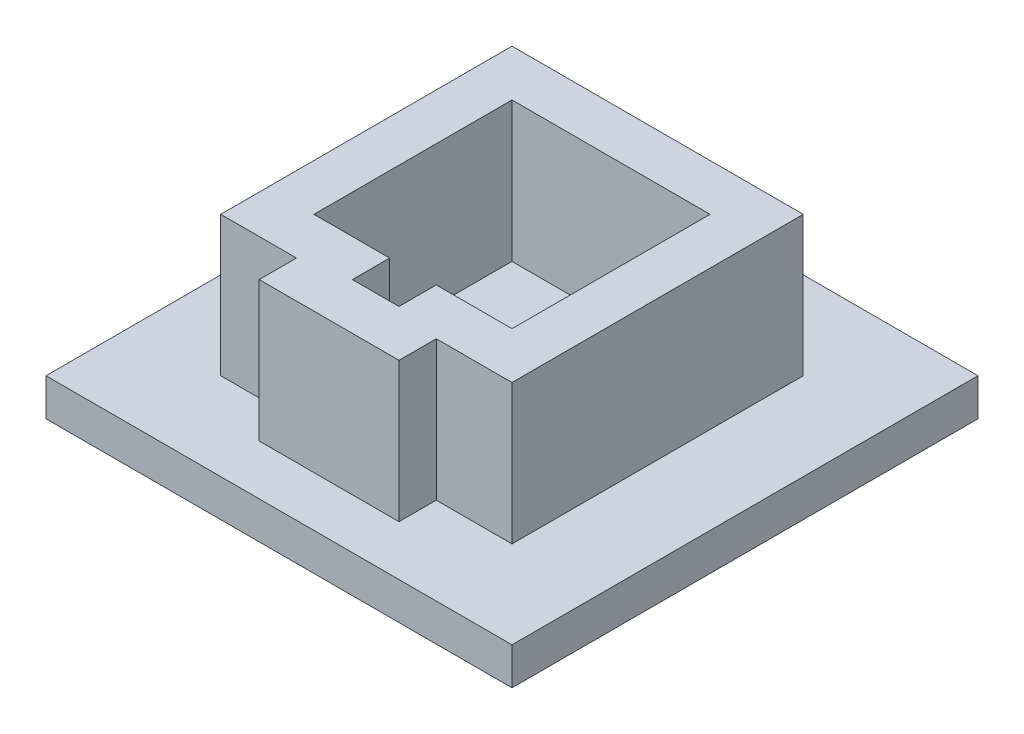
ISO-10303-21;
HEADER;
FILE_DESCRIPTION(('STEP AP214'),'2;1');
FILE_NAME('part.step','',(''),(''),'','','');
FILE_SCHEMA(('AUTOMOTIVE_DESIGN { 1 0 10303 214 1 1 1 1 }'));
ENDSEC;
DATA;
#1=APPLICATION_CONTEXT('core data for automotive mechanical design processes');
#2=APPLICATION_PROTOCOL_DEFINITION('international standard','automotive_design',2000,#1);
#3=PRODUCT_CONTEXT('',#1,'mechanical');
#4=PRODUCT('Part','Part','',(#3));
#5=PRODUCT_RELATED_PRODUCT_CATEGORY('part','',(#4));
#6=PRODUCT_DEFINITION_FORMATION('','',#4);
#7=PRODUCT_DEFINITION_CONTEXT('part definition',#1,'design');
#8=PRODUCT_DEFINITION('design','',#6,#7);
#9=PRODUCT_DEFINITION_SHAPE('','',#8);
#10=(LENGTH_UNIT() NAMED_UNIT(*) SI_UNIT(.MILLI.,.METRE.));
#11=(NAMED_UNIT(*) PLANE_ANGLE_UNIT() SI_UNIT($,.RADIAN.));
#12=(NAMED_UNIT(*) SI_UNIT($,.STERADIAN.) SOLID_ANGLE_UNIT());
#13=UNCERTAINTY_MEASURE_WITH_UNIT(LENGTH_MEASURE(1.E-05),#10,'distance_accuracy_value','');
#14=(GEOMETRIC_REPRESENTATION_CONTEXT(3) GLOBAL_UNCERTAINTY_ASSIGNED_CONTEXT((#13)) GLOBAL_UNIT_ASSIGNED_CONTEXT((#10,
#11,#12)) REPRESENTATION_CONTEXT('',''));
#15=CARTESIAN_POINT('',(0.,0.,0.));
#16=DIRECTION('',(0.,0.,1.));
#17=DIRECTION('',(1.,0.,0.));
#18=AXIS2_PLACEMENT_3D('',#15,#16,#17);
#19=CARTESIAN_POINT('',(0.,38.,0.));
#20=DIRECTION('',(0.,-1.,0.));
#21=DIRECTION('',(0.,0.,-1.));
#22=AXIS2_PLACEMENT_3D('',#19,#20,#21);
#23=PLANE('',#22);
#24=DIRECTION('',(0.,0.,1.));
#25=VECTOR('',#24,1.);
#26=CARTESIAN_POINT('',(28.75,38.,-71.25));
#27=LINE('',#26,#25);
#28=CARTESIAN_POINT('',(28.75,38.,-71.25));
#29=VERTEX_POINT('',#28);
#30=CARTESIAN_POINT('',(28.75,38.,-28.75));
#31=VERTEX_POINT('',#30);
#32=EDGE_CURVE('E249',#29,#31,#27,.T.);
#33=ORIENTED_EDGE('',*,*,#32,.F.);
#34=DIRECTION('',(-1.,0.,0.));
#35=VECTOR('',#34,1.);
#36=CARTESIAN_POINT('',(28.75,38.,-71.25));
#37=LINE('',#36,#35);
#38=CARTESIAN_POINT('',(71.25,38.,-71.25));
#39=VERTEX_POINT('',#38);
#40=EDGE_CURVE('E265',#39,#29,#37,.T.);
#41=ORIENTED_EDGE('',*,*,#40,.F.);
#42=DIRECTION('',(0.,0.,-1.));
#43=VECTOR('',#42,1.);
#44=CARTESIAN_POINT('',(71.25,38.,-71.25));
#45=LINE('',#44,#43);
#46=CARTESIAN_POINT('',(71.25,38.,-28.75));
#47=VERTEX_POINT('',#46);
#48=EDGE_CURVE('E262',#47,#39,#45,.T.);
#49=ORIENTED_EDGE('',*,*,#48,.F.);
#50=DIRECTION('',(1.,0.,0.));
#51=VECTOR('',#50,1.);
#52=CARTESIAN_POINT('',(55.,38.,-28.75));
#53=LINE('',#52,#51);
#54=CARTESIAN_POINT('',(55.,38.,-28.75));
#55=VERTEX_POINT('',#54);
#56=EDGE_CURVE('E260',#55,#47,#53,.T.);
#57=ORIENTED_EDGE('',*,*,#56,.F.);
#58=DIRECTION('',(0.,0.,-1.));
#59=VECTOR('',#58,1.);
#60=CARTESIAN_POINT('',(55.,38.,-28.75));
#61=LINE('',#60,#59);
#62=CARTESIAN_POINT('',(55.,38.,-20.75));
#63=VERTEX_POINT('',#62);
#64=EDGE_CURVE('E258',#63,#55,#61,.T.);
#65=ORIENTED_EDGE('',*,*,#64,.F.);
#66=DIRECTION('',(1.,0.,0.));
#67=VECTOR('',#66,1.);
#68=CARTESIAN_POINT('',(45.,38.,-20.75));
#69=LINE('',#68,#67);
#70=CARTESIAN_POINT('',(45.,38.,-20.75));
#71=VERTEX_POINT('',#70);
#72=EDGE_CURVE('E256',#71,#63,#69,.T.);
#73=ORIENTED_EDGE('',*,*,#72,.F.);
#74=DIRECTION('',(0.,0.,1.));
#75=VECTOR('',#74,1.);
#76=CARTESIAN_POINT('',(45.,38.,-28.75));
#77=LINE('',#76,#75);
#78=CARTESIAN_POINT('',(45.,38.,-28.75));
#79=VERTEX_POINT('',#78);
#80=EDGE_CURVE('E254',#79,#71,#77,.T.);
#81=ORIENTED_EDGE('',*,*,#80,.F.);
#82=DIRECTION('',(1.,0.,0.));
#83=VECTOR('',#82,1.);
#84=CARTESIAN_POINT('',(28.75,38.,-28.75));
#85=LINE('',#84,#83);
#86=EDGE_CURVE('E251',#31,#79,#85,.T.);
#87=ORIENTED_EDGE('',*,*,#86,.F.);
#88=EDGE_LOOP('',(#33,#41,#49,#57,#65,#73,#81,#87));
#89=FACE_BOUND('',#88,.T.);
#90=DIRECTION('',(0.,0.,1.));
#91=VECTOR('',#90,1.);
#92=CARTESIAN_POINT('',(18.75,38.,-81.25));
#93=LINE('',#92,#91);
#94=CARTESIAN_POINT('',(18.75,38.,-81.25));
#95=VERTEX_POINT('',#94);
#96=CARTESIAN_POINT('',(18.75,38.,-18.75));
#97=VERTEX_POINT('',#96);
#98=EDGE_CURVE('E214',#95,#97,#93,.T.);
#99=ORIENTED_EDGE('',*,*,#98,.T.);
#100=DIRECTION('',(1.,0.,0.));
#101=VECTOR('',#100,1.);
#102=CARTESIAN_POINT('',(18.75,38.,-18.75));
#103=LINE('',#102,#101);
#104=CARTESIAN_POINT('',(35.,38.,-18.75));
#105=VERTEX_POINT('',#104);
#106=EDGE_CURVE('E174',#97,#105,#103,.T.);
#107=ORIENTED_EDGE('',*,*,#106,.T.);
#108=DIRECTION('',(0.,0.,1.));
#109=VECTOR('',#108,1.);
#110=CARTESIAN_POINT('',(35.,38.,-18.75));
#111=LINE('',#110,#109);
#112=CARTESIAN_POINT('',(35.,38.,-10.75));
#113=VERTEX_POINT('',#112);
#114=EDGE_CURVE('E55',#105,#113,#111,.T.);
#115=ORIENTED_EDGE('',*,*,#114,.T.);
#116=DIRECTION('',(1.,0.,0.));
#117=VECTOR('',#116,1.);
#118=CARTESIAN_POINT('',(35.,38.,-10.75));
#119=LINE('',#118,#117);
#120=CARTESIAN_POINT('',(65.,38.,-10.75));
#121=VERTEX_POINT('',#120);
#122=EDGE_CURVE('E218',#113,#121,#119,.T.);
#123=ORIENTED_EDGE('',*,*,#122,.T.);
#124=DIRECTION('',(0.,0.,-1.));
#125=VECTOR('',#124,1.);
#126=CARTESIAN_POINT('',(65.,38.,-10.75));
#127=LINE('',#126,#125);
#128=CARTESIAN_POINT('',(65.,38.,-18.75));
#129=VERTEX_POINT('',#128);
#130=EDGE_CURVE('E221',#121,#129,#127,.T.);
#131=ORIENTED_EDGE('',*,*,#130,.T.);
#132=DIRECTION('',(1.,0.,0.));
#133=VECTOR('',#132,1.);
#134=CARTESIAN_POINT('',(65.,38.,-18.75));
#135=LINE('',#134,#133);
#136=CARTESIAN_POINT('',(81.25,38.,-18.75));
#137=VERTEX_POINT('',#136);
#138=EDGE_CURVE('E224',#129,#137,#135,.T.);
#139=ORIENTED_EDGE('',*,*,#138,.T.);
#140=DIRECTION('',(0.,0.,-1.));
#141=VECTOR('',#140,1.);
#142=CARTESIAN_POINT('',(81.25,38.,-81.25));
#143=LINE('',#142,#141);
#144=CARTESIAN_POINT('',(81.25,38.,-81.25));
#145=VERTEX_POINT('',#144);
#146=EDGE_CURVE('E197',#137,#145,#143,.T.);
#147=ORIENTED_EDGE('',*,*,#146,.T.);
#148=DIRECTION('',(-1.,0.,0.));
#149=VECTOR('',#148,1.);
#150=CARTESIAN_POINT('',(18.75,38.,-81.25));
#151=LINE('',#150,#149);
#152=EDGE_CURVE('E194',#145,#95,#151,.T.);
#153=ORIENTED_EDGE('',*,*,#152,.T.);
#154=EDGE_LOOP('',(#99,#107,#115,#123,#131,#139,#147,#153));
#155=FACE_BOUND('',#154,.T.);
#156=ADVANCED_FACE('F32',(#89,#155),#23,.F.);
#157=CARTESIAN_POINT('',(28.75,38.,-71.25));
#158=DIRECTION('',(1.,0.,0.));
#159=DIRECTION('',(0.,0.,-1.));
#160=AXIS2_PLACEMENT_3D('',#157,#158,#159);
#161=PLANE('',#160);
#162=DIRECTION('',(0.,0.,1.));
#163=VECTOR('',#162,1.);
#164=CARTESIAN_POINT('',(28.75,8.,-71.25));
#165=LINE('',#164,#163);
#166=CARTESIAN_POINT('',(28.75,8.,-71.25));
#167=VERTEX_POINT('',#166);
#168=CARTESIAN_POINT('',(28.75,8.,-28.75));
#169=VERTEX_POINT('',#168);
#170=EDGE_CURVE('E248',#167,#169,#165,.T.);
#171=ORIENTED_EDGE('',*,*,#170,.F.);
#172=DIRECTION('',(0.,-1.,0.));
#173=VECTOR('',#172,1.);
#174=CARTESIAN_POINT('',(28.75,38.,-71.25));
#175=LINE('',#174,#173);
#176=EDGE_CURVE('E267',#29,#167,#175,.T.);
#177=ORIENTED_EDGE('',*,*,#176,.F.);
#178=ORIENTED_EDGE('',*,*,#32,.T.);
#179=DIRECTION('',(0.,-1.,0.));
#180=VECTOR('',#179,1.);
#181=CARTESIAN_POINT('',(28.75,38.,-28.75));
#182=LINE('',#181,#180);
#183=EDGE_CURVE('E303',#31,#169,#182,.T.);
#184=ORIENTED_EDGE('',*,*,#183,.T.);
#185=EDGE_LOOP('',(#171,#177,#178,#184));
#186=FACE_BOUND('',#185,.T.);
#187=ADVANCED_FACE('F345',(#186),#161,.T.);
#188=CARTESIAN_POINT('',(28.75,38.,-28.75));
#189=DIRECTION('',(0.,0.,-1.));
#190=DIRECTION('',(-1.,0.,0.));
#191=AXIS2_PLACEMENT_3D('',#188,#189,#190);
#192=PLANE('',#191);
#193=DIRECTION('',(1.,0.,0.));
#194=VECTOR('',#193,1.);
#195=CARTESIAN_POINT('',(28.75,8.,-28.75));
#196=LINE('',#195,#194);
#197=CARTESIAN_POINT('',(45.,8.,-28.75));
#198=VERTEX_POINT('',#197);
#199=EDGE_CURVE('E270',#169,#198,#196,.T.);
#200=ORIENTED_EDGE('',*,*,#199,.F.);
#201=ORIENTED_EDGE('',*,*,#183,.F.);
#202=ORIENTED_EDGE('',*,*,#86,.T.);
#203=DIRECTION('',(0.,-1.,0.));
#204=VECTOR('',#203,1.);
#205=CARTESIAN_POINT('',(45.,38.,-28.75));
#206=LINE('',#205,#204);
#207=EDGE_CURVE('E301',#79,#198,#206,.T.);
#208=ORIENTED_EDGE('',*,*,#207,.T.);
#209=EDGE_LOOP('',(#200,#201,#202,#208));
#210=FACE_BOUND('',#209,.T.);
#211=ADVANCED_FACE('F353',(#210),#192,.T.);
#212=CARTESIAN_POINT('',(45.,38.,-28.75));
#213=DIRECTION('',(1.,0.,0.));
#214=DIRECTION('',(0.,0.,-1.));
#215=AXIS2_PLACEMENT_3D('',#212,#213,#214);
#216=PLANE('',#215);
#217=DIRECTION('',(0.,0.,1.));
#218=VECTOR('',#217,1.);
#219=CARTESIAN_POINT('',(45.,8.,-28.75));
#220=LINE('',#219,#218);
#221=CARTESIAN_POINT('',(45.,8.,-20.75));
#222=VERTEX_POINT('',#221);
#223=EDGE_CURVE('E273',#198,#222,#220,.T.);
#224=ORIENTED_EDGE('',*,*,#223,.F.);
#225=ORIENTED_EDGE('',*,*,#207,.F.);
#226=ORIENTED_EDGE('',*,*,#80,.T.);
#227=DIRECTION('',(0.,-1.,0.));
#228=VECTOR('',#227,1.);
#229=CARTESIAN_POINT('',(45.,38.,-20.75));
#230=LINE('',#229,#228);
#231=EDGE_CURVE('E299',#71,#222,#230,.T.);
#232=ORIENTED_EDGE('',*,*,#231,.T.);
#233=EDGE_LOOP('',(#224,#225,#226,#232));
#234=FACE_BOUND('',#233,.T.);
#235=ADVANCED_FACE('F426',(#234),#216,.T.);
#236=CARTESIAN_POINT('',(45.,38.,-20.75));
#237=DIRECTION('',(0.,0.,-1.));
#238=DIRECTION('',(-1.,0.,0.));
#239=AXIS2_PLACEMENT_3D('',#236,#237,#238);
#240=PLANE('',#239);
#241=DIRECTION('',(1.,0.,0.));
#242=VECTOR('',#241,1.);
#243=CARTESIAN_POINT('',(45.,8.,-20.75));
#244=LINE('',#243,#242);
#245=CARTESIAN_POINT('',(55.,8.,-20.75));
#246=VERTEX_POINT('',#245);
#247=EDGE_CURVE('E276',#222,#246,#244,.T.);
#248=ORIENTED_EDGE('',*,*,#247,.F.);
#249=ORIENTED_EDGE('',*,*,#231,.F.);
#250=ORIENTED_EDGE('',*,*,#72,.T.);
#251=DIRECTION('',(0.,-1.,0.));
#252=VECTOR('',#251,1.);
#253=CARTESIAN_POINT('',(55.,38.,-20.75));
#254=LINE('',#253,#252);
#255=EDGE_CURVE('E297',#63,#246,#254,.T.);
#256=ORIENTED_EDGE('',*,*,#255,.T.);
#257=EDGE_LOOP('',(#248,#249,#250,#256));
#258=FACE_BOUND('',#257,.T.);
#259=ADVANCED_FACE('F434',(#258),#240,.T.);
#260=CARTESIAN_POINT('',(55.,38.,-28.75));
#261=DIRECTION('',(-1.,0.,0.));
#262=DIRECTION('',(0.,0.,1.));
#263=AXIS2_PLACEMENT_3D('',#260,#261,#262);
#264=PLANE('',#263);
#265=DIRECTION('',(0.,0.,-1.));
#266=VECTOR('',#265,1.);
#267=CARTESIAN_POINT('',(55.,8.,-28.75));
#268=LINE('',#267,#266);
#269=CARTESIAN_POINT('',(55.,8.,-28.75));
#270=VERTEX_POINT('',#269);
#271=EDGE_CURVE('E279',#246,#270,#268,.T.);
#272=ORIENTED_EDGE('',*,*,#271,.F.);
#273=ORIENTED_EDGE('',*,*,#255,.F.);
#274=ORIENTED_EDGE('',*,*,#64,.T.);
#275=DIRECTION('',(0.,-1.,0.));
#276=VECTOR('',#275,1.);
#277=CARTESIAN_POINT('',(55.,38.,-28.75));
#278=LINE('',#277,#276);
#279=EDGE_CURVE('E295',#55,#270,#278,.T.);
#280=ORIENTED_EDGE('',*,*,#279,.T.);
#281=EDGE_LOOP('',(#272,#273,#274,#280));
#282=FACE_BOUND('',#281,.T.);
#283=ADVANCED_FACE('F443',(#282),#264,.T.);
#284=CARTESIAN_POINT('',(55.,38.,-28.75));
#285=DIRECTION('',(0.,0.,-1.));
#286=DIRECTION('',(-1.,0.,0.));
#287=AXIS2_PLACEMENT_3D('',#284,#285,#286);
#288=PLANE('',#287);
#289=DIRECTION('',(1.,0.,0.));
#290=VECTOR('',#289,1.);
#291=CARTESIAN_POINT('',(55.,8.,-28.75));
#292=LINE('',#291,#290);
#293=CARTESIAN_POINT('',(71.25,8.,-28.75));
#294=VERTEX_POINT('',#293);
#295=EDGE_CURVE('E282',#270,#294,#292,.T.);
#296=ORIENTED_EDGE('',*,*,#295,.F.);
#297=ORIENTED_EDGE('',*,*,#279,.F.);
#298=ORIENTED_EDGE('',*,*,#56,.T.);
#299=DIRECTION('',(0.,-1.,0.));
#300=VECTOR('',#299,1.);
#301=CARTESIAN_POINT('',(71.25,38.,-28.75));
#302=LINE('',#301,#300);
#303=EDGE_CURVE('E293',#47,#294,#302,.T.);
#304=ORIENTED_EDGE('',*,*,#303,.T.);
#305=EDGE_LOOP('',(#296,#297,#298,#304));
#306=FACE_BOUND('',#305,.T.);
#307=ADVANCED_FACE('F452',(#306),#288,.T.);
#308=CARTESIAN_POINT('',(71.25,38.,-71.25));
#309=DIRECTION('',(-1.,0.,0.));
#310=DIRECTION('',(0.,0.,1.));
#311=AXIS2_PLACEMENT_3D('',#308,#309,#310);
#312=PLANE('',#311);
#313=DIRECTION('',(0.,0.,-1.));
#314=VECTOR('',#313,1.);
#315=CARTESIAN_POINT('',(71.25,8.,-71.25));
#316=LINE('',#315,#314);
#317=CARTESIAN_POINT('',(71.25,8.,-71.25));
#318=VERTEX_POINT('',#317);
#319=EDGE_CURVE('E285',#294,#318,#316,.T.);
#320=ORIENTED_EDGE('',*,*,#319,.F.);
#321=ORIENTED_EDGE('',*,*,#303,.F.);
#322=ORIENTED_EDGE('',*,*,#48,.T.);
#323=DIRECTION('',(0.,-1.,0.));
#324=VECTOR('',#323,1.);
#325=CARTESIAN_POINT('',(71.25,38.,-71.25));
#326=LINE('',#325,#324);
#327=EDGE_CURVE('E291',#39,#318,#326,.T.);
#328=ORIENTED_EDGE('',*,*,#327,.T.);
#329=EDGE_LOOP('',(#320,#321,#322,#328));
#330=FACE_BOUND('',#329,.T.);
#331=ADVANCED_FACE('F461',(#330),#312,.T.);
#332=CARTESIAN_POINT('',(28.75,38.,-71.25));
#333=DIRECTION('',(0.,0.,1.));
#334=DIRECTION('',(1.,0.,0.));
#335=AXIS2_PLACEMENT_3D('',#332,#333,#334);
#336=PLANE('',#335);
#337=DIRECTION('',(-1.,0.,0.));
#338=VECTOR('',#337,1.);
#339=CARTESIAN_POINT('',(28.75,8.,-71.25));
#340=LINE('',#339,#338);
#341=EDGE_CURVE('E252',#318,#167,#340,.T.);
#342=ORIENTED_EDGE('',*,*,#341,.F.);
#343=ORIENTED_EDGE('',*,*,#327,.F.);
#344=ORIENTED_EDGE('',*,*,#40,.T.);
#345=ORIENTED_EDGE('',*,*,#176,.T.);
#346=EDGE_LOOP('',(#342,#343,#344,#345));
#347=FACE_BOUND('',#346,.T.);
#348=ADVANCED_FACE('F363',(#347),#336,.T.);
#349=CARTESIAN_POINT('',(0.,8.,0.));
#350=DIRECTION('',(0.,-1.,0.));
#351=DIRECTION('',(0.,0.,-1.));
#352=AXIS2_PLACEMENT_3D('',#349,#350,#351);
#353=PLANE('',#352);
#354=ORIENTED_EDGE('',*,*,#341,.T.);
#355=ORIENTED_EDGE('',*,*,#170,.T.);
#356=ORIENTED_EDGE('',*,*,#199,.T.);
#357=ORIENTED_EDGE('',*,*,#223,.T.);
#358=ORIENTED_EDGE('',*,*,#247,.T.);
#359=ORIENTED_EDGE('',*,*,#271,.T.);
#360=ORIENTED_EDGE('',*,*,#295,.T.);
#361=ORIENTED_EDGE('',*,*,#319,.T.);
#362=EDGE_LOOP('',(#354,#355,#356,#357,#358,#359,#360,#361));
#363=FACE_BOUND('',#362,.T.);
#364=ADVANCED_FACE('F360',(#363),#353,.F.);
#365=CARTESIAN_POINT('',(0.,8.,0.));
#366=DIRECTION('',(0.,-1.,0.));
#367=DIRECTION('',(0.,0.,-1.));
#368=AXIS2_PLACEMENT_3D('',#365,#366,#367);
#369=PLANE('',#368);
#370=DIRECTION('',(0.,0.,1.));
#371=VECTOR('',#370,1.);
#372=CARTESIAN_POINT('',(18.75,8.,-81.25));
#373=LINE('',#372,#371);
#374=CARTESIAN_POINT('',(18.75,8.,-81.25));
#375=VERTEX_POINT('',#374);
#376=CARTESIAN_POINT('',(18.75,8.,-18.75));
#377=VERTEX_POINT('',#376);
#378=EDGE_CURVE('E186',#375,#377,#373,.T.);
#379=ORIENTED_EDGE('',*,*,#378,.F.);
#380=DIRECTION('',(-1.,0.,0.));
#381=VECTOR('',#380,1.);
#382=CARTESIAN_POINT('',(18.75,8.,-81.25));
#383=LINE('',#382,#381);
#384=CARTESIAN_POINT('',(81.25,8.,-81.25));
#385=VERTEX_POINT('',#384);
#386=EDGE_CURVE('E180',#385,#375,#383,.T.);
#387=ORIENTED_EDGE('',*,*,#386,.F.);
#388=DIRECTION('',(0.,0.,-1.));
#389=VECTOR('',#388,1.);
#390=CARTESIAN_POINT('',(81.25,8.,-81.25));
#391=LINE('',#390,#389);
#392=CARTESIAN_POINT('',(81.25,8.,-18.75));
#393=VERTEX_POINT('',#392);
#394=EDGE_CURVE('E210',#393,#385,#391,.T.);
#395=ORIENTED_EDGE('',*,*,#394,.F.);
#396=DIRECTION('',(1.,0.,0.));
#397=VECTOR('',#396,1.);
#398=CARTESIAN_POINT('',(65.,8.,-18.75));
#399=LINE('',#398,#397);
#400=CARTESIAN_POINT('',(65.,8.,-18.75));
#401=VERTEX_POINT('',#400);
#402=EDGE_CURVE('E207',#401,#393,#399,.T.);
#403=ORIENTED_EDGE('',*,*,#402,.F.);
#404=DIRECTION('',(0.,0.,-1.));
#405=VECTOR('',#404,1.);
#406=CARTESIAN_POINT('',(65.,8.,-10.75));
#407=LINE('',#406,#405);
#408=CARTESIAN_POINT('',(65.,8.,-10.75));
#409=VERTEX_POINT('',#408);
#410=EDGE_CURVE('E204',#409,#401,#407,.T.);
#411=ORIENTED_EDGE('',*,*,#410,.F.);
#412=DIRECTION('',(1.,0.,0.));
#413=VECTOR('',#412,1.);
#414=CARTESIAN_POINT('',(35.,8.,-10.75));
#415=LINE('',#414,#413);
#416=CARTESIAN_POINT('',(35.,8.,-10.75));
#417=VERTEX_POINT('',#416);
#418=EDGE_CURVE('E201',#417,#409,#415,.T.);
#419=ORIENTED_EDGE('',*,*,#418,.F.);
#420=DIRECTION('',(0.,0.,1.));
#421=VECTOR('',#420,1.);
#422=CARTESIAN_POINT('',(35.,8.,-18.75));
#423=LINE('',#422,#421);
#424=CARTESIAN_POINT('',(35.,8.,-18.75));
#425=VERTEX_POINT('',#424);
#426=EDGE_CURVE('E190',#425,#417,#423,.T.);
#427=ORIENTED_EDGE('',*,*,#426,.F.);
#428=DIRECTION('',(1.,0.,0.));
#429=VECTOR('',#428,1.);
#430=CARTESIAN_POINT('',(18.75,8.,-18.75));
#431=LINE('',#430,#429);
#432=EDGE_CURVE('E172',#377,#425,#431,.T.);
#433=ORIENTED_EDGE('',*,*,#432,.F.);
#434=EDGE_LOOP('',(#379,#387,#395,#403,#411,#419,#427,#433));
#435=FACE_BOUND('',#434,.T.);
#436=DIRECTION('',(0.,0.,1.));
#437=VECTOR('',#436,1.);
#438=CARTESIAN_POINT('',(0.,8.,0.));
#439=LINE('',#438,#437);
#440=CARTESIAN_POINT('',(0.,8.,-100.));
#441=VERTEX_POINT('',#440);
#442=CARTESIAN_POINT('',(0.,8.,0.));
#443=VERTEX_POINT('',#442);
#444=EDGE_CURVE('E230',#441,#443,#439,.T.);
#445=ORIENTED_EDGE('',*,*,#444,.T.);
#446=DIRECTION('',(1.,0.,0.));
#447=VECTOR('',#446,1.);
#448=CARTESIAN_POINT('',(0.,8.,0.));
#449=LINE('',#448,#447);
#450=CARTESIAN_POINT('',(100.,8.,0.));
#451=VERTEX_POINT('',#450);
#452=EDGE_CURVE('E243',#443,#451,#449,.T.);
#453=ORIENTED_EDGE('',*,*,#452,.T.);
#454=DIRECTION('',(0.,0.,-1.));
#455=VECTOR('',#454,1.);
#456=CARTESIAN_POINT('',(100.,8.,0.));
#457=LINE('',#456,#455);
#458=CARTESIAN_POINT('',(100.,8.,-100.));
#459=VERTEX_POINT('',#458);
#460=EDGE_CURVE('E47',#451,#459,#457,.T.);
#461=ORIENTED_EDGE('',*,*,#460,.T.);
#462=DIRECTION('',(-1.,0.,0.));
#463=VECTOR('',#462,1.);
#464=CARTESIAN_POINT('',(0.,8.,-100.));
#465=LINE('',#464,#463);
#466=EDGE_CURVE('E246',#459,#441,#465,.T.);
#467=ORIENTED_EDGE('',*,*,#466,.T.);
#468=EDGE_LOOP('',(#445,#453,#461,#467));
#469=FACE_BOUND('',#468,.T.);
#470=ADVANCED_FACE('F184',(#435,#469),#369,.F.);
#471=CARTESIAN_POINT('',(18.75,8.,-81.25));
#472=DIRECTION('',(-1.,0.,0.));
#473=DIRECTION('',(0.,0.,1.));
#474=AXIS2_PLACEMENT_3D('',#471,#472,#473);
#475=PLANE('',#474);
#476=ORIENTED_EDGE('',*,*,#98,.F.);
#477=DIRECTION('',(0.,1.,0.));
#478=VECTOR('',#477,1.);
#479=CARTESIAN_POINT('',(18.75,8.,-81.25));
#480=LINE('',#479,#478);
#481=EDGE_CURVE('E193',#375,#95,#480,.T.);
#482=ORIENTED_EDGE('',*,*,#481,.F.);
#483=ORIENTED_EDGE('',*,*,#378,.T.);
#484=DIRECTION('',(0.,1.,0.));
#485=VECTOR('',#484,1.);
#486=CARTESIAN_POINT('',(18.75,8.,-18.75));
#487=LINE('',#486,#485);
#488=EDGE_CURVE('E169',#377,#97,#487,.T.);
#489=ORIENTED_EDGE('',*,*,#488,.T.);
#490=EDGE_LOOP('',(#476,#482,#483,#489));
#491=FACE_BOUND('',#490,.T.);
#492=ADVANCED_FACE('F192',(#491),#475,.T.);
#493=CARTESIAN_POINT('',(18.75,8.,-81.25));
#494=DIRECTION('',(0.,0.,-1.));
#495=DIRECTION('',(-1.,0.,0.));
#496=AXIS2_PLACEMENT_3D('',#493,#494,#495);
#497=PLANE('',#496);
#498=ORIENTED_EDGE('',*,*,#152,.F.);
#499=DIRECTION('',(0.,1.,0.));
#500=VECTOR('',#499,1.);
#501=CARTESIAN_POINT('',(81.25,8.,-81.25));
#502=LINE('',#501,#500);
#503=EDGE_CURVE('E231',#385,#145,#502,.T.);
#504=ORIENTED_EDGE('',*,*,#503,.F.);
#505=ORIENTED_EDGE('',*,*,#386,.T.);
#506=ORIENTED_EDGE('',*,*,#481,.T.);
#507=EDGE_LOOP('',(#498,#504,#505,#506));
#508=FACE_BOUND('',#507,.T.);
#509=ADVANCED_FACE('F495',(#508),#497,.T.);
#510=CARTESIAN_POINT('',(81.25,8.,-81.25));
#511=DIRECTION('',(1.,0.,0.));
#512=DIRECTION('',(0.,0.,-1.));
#513=AXIS2_PLACEMENT_3D('',#510,#511,#512);
#514=PLANE('',#513);
#515=ORIENTED_EDGE('',*,*,#146,.F.);
#516=DIRECTION('',(0.,1.,0.));
#517=VECTOR('',#516,1.);
#518=CARTESIAN_POINT('',(81.25,8.,-18.75));
#519=LINE('',#518,#517);
#520=EDGE_CURVE('E233',#393,#137,#519,.T.);
#521=ORIENTED_EDGE('',*,*,#520,.F.);
#522=ORIENTED_EDGE('',*,*,#394,.T.);
#523=ORIENTED_EDGE('',*,*,#503,.T.);
#524=EDGE_LOOP('',(#515,#521,#522,#523));
#525=FACE_BOUND('',#524,.T.);
#526=ADVANCED_FACE('F503',(#525),#514,.T.);
#527=CARTESIAN_POINT('',(65.,8.,-18.75));
#528=DIRECTION('',(0.,0.,1.));
#529=DIRECTION('',(1.,0.,0.));
#530=AXIS2_PLACEMENT_3D('',#527,#528,#529);
#531=PLANE('',#530);
#532=ORIENTED_EDGE('',*,*,#138,.F.);
#533=DIRECTION('',(0.,1.,0.));
#534=VECTOR('',#533,1.);
#535=CARTESIAN_POINT('',(65.,8.,-18.75));
#536=LINE('',#535,#534);
#537=EDGE_CURVE('E235',#401,#129,#536,.T.);
#538=ORIENTED_EDGE('',*,*,#537,.F.);
#539=ORIENTED_EDGE('',*,*,#402,.T.);
#540=ORIENTED_EDGE('',*,*,#520,.T.);
#541=EDGE_LOOP('',(#532,#538,#539,#540));
#542=FACE_BOUND('',#541,.T.);
#543=ADVANCED_FACE('F512',(#542),#531,.T.);
#544=CARTESIAN_POINT('',(65.,8.,-10.75));
#545=DIRECTION('',(1.,0.,0.));
#546=DIRECTION('',(0.,0.,-1.));
#547=AXIS2_PLACEMENT_3D('',#544,#545,#546);
#548=PLANE('',#547);
#549=ORIENTED_EDGE('',*,*,#130,.F.);
#550=DIRECTION('',(0.,1.,0.));
#551=VECTOR('',#550,1.);
#552=CARTESIAN_POINT('',(65.,8.,-10.75));
#553=LINE('',#552,#551);
#554=EDGE_CURVE('E237',#409,#121,#553,.T.);
#555=ORIENTED_EDGE('',*,*,#554,.F.);
#556=ORIENTED_EDGE('',*,*,#410,.T.);
#557=ORIENTED_EDGE('',*,*,#537,.T.);
#558=EDGE_LOOP('',(#549,#555,#556,#557));
#559=FACE_BOUND('',#558,.T.);
#560=ADVANCED_FACE('F521',(#559),#548,.T.);
#561=CARTESIAN_POINT('',(35.,8.,-10.75));
#562=DIRECTION('',(0.,0.,1.));
#563=DIRECTION('',(1.,0.,0.));
#564=AXIS2_PLACEMENT_3D('',#561,#562,#563);
#565=PLANE('',#564);
#566=ORIENTED_EDGE('',*,*,#122,.F.);
#567=DIRECTION('',(0.,1.,0.));
#568=VECTOR('',#567,1.);
#569=CARTESIAN_POINT('',(35.,8.,-10.75));
#570=LINE('',#569,#568);
#571=EDGE_CURVE('E239',#417,#113,#570,.T.);
#572=ORIENTED_EDGE('',*,*,#571,.F.);
#573=ORIENTED_EDGE('',*,*,#418,.T.);
#574=ORIENTED_EDGE('',*,*,#554,.T.);
#575=EDGE_LOOP('',(#566,#572,#573,#574));
#576=FACE_BOUND('',#575,.T.);
#577=ADVANCED_FACE('F530',(#576),#565,.T.);
#578=CARTESIAN_POINT('',(35.,8.,-18.75));
#579=DIRECTION('',(-1.,0.,0.));
#580=DIRECTION('',(0.,0.,1.));
#581=AXIS2_PLACEMENT_3D('',#578,#579,#580);
#582=PLANE('',#581);
#583=ORIENTED_EDGE('',*,*,#114,.F.);
#584=DIRECTION('',(0.,1.,0.));
#585=VECTOR('',#584,1.);
#586=CARTESIAN_POINT('',(35.,8.,-18.75));
#587=LINE('',#586,#585);
#588=EDGE_CURVE('E179',#425,#105,#587,.T.);
#589=ORIENTED_EDGE('',*,*,#588,.F.);
#590=ORIENTED_EDGE('',*,*,#426,.T.);
#591=ORIENTED_EDGE('',*,*,#571,.T.);
#592=EDGE_LOOP('',(#583,#589,#590,#591));
#593=FACE_BOUND('',#592,.T.);
#594=ADVANCED_FACE('F539',(#593),#582,.T.);
#595=CARTESIAN_POINT('',(18.75,8.,-18.75));
#596=DIRECTION('',(0.,0.,1.));
#597=DIRECTION('',(1.,0.,0.));
#598=AXIS2_PLACEMENT_3D('',#595,#596,#597);
#599=PLANE('',#598);
#600=ORIENTED_EDGE('',*,*,#106,.F.);
#601=ORIENTED_EDGE('',*,*,#488,.F.);
#602=ORIENTED_EDGE('',*,*,#432,.T.);
#603=ORIENTED_EDGE('',*,*,#588,.T.);
#604=EDGE_LOOP('',(#600,#601,#602,#603));
#605=FACE_BOUND('',#604,.T.);
#606=ADVANCED_FACE('F171',(#605),#599,.T.);
#607=CARTESIAN_POINT('',(0.,0.,0.));
#608=DIRECTION('',(0.,-1.,0.));
#609=DIRECTION('',(0.,0.,-1.));
#610=AXIS2_PLACEMENT_3D('',#607,#608,#609);
#611=PLANE('',#610);
#612=DIRECTION('',(0.,0.,1.));
#613=VECTOR('',#612,1.);
#614=CARTESIAN_POINT('',(0.,0.,0.));
#615=LINE('',#614,#613);
#616=CARTESIAN_POINT('',(0.,0.,-100.));
#617=VERTEX_POINT('',#616);
#618=CARTESIAN_POINT('',(0.,0.,0.));
#619=VERTEX_POINT('',#618);
#620=EDGE_CURVE('E306',#617,#619,#615,.T.);
#621=ORIENTED_EDGE('',*,*,#620,.F.);
#622=DIRECTION('',(-1.,0.,0.));
#623=VECTOR('',#622,1.);
#624=CARTESIAN_POINT('',(0.,0.,-100.));
#625=LINE('',#624,#623);
#626=CARTESIAN_POINT('',(100.,0.,-100.));
#627=VERTEX_POINT('',#626);
#628=EDGE_CURVE('E315',#627,#617,#625,.T.);
#629=ORIENTED_EDGE('',*,*,#628,.F.);
#630=DIRECTION('',(0.,0.,-1.));
#631=VECTOR('',#630,1.);
#632=CARTESIAN_POINT('',(100.,0.,0.));
#633=LINE('',#632,#631);
#634=CARTESIAN_POINT('',(100.,0.,0.));
#635=VERTEX_POINT('',#634);
#636=EDGE_CURVE('E312',#635,#627,#633,.T.);
#637=ORIENTED_EDGE('',*,*,#636,.F.);
#638=DIRECTION('',(1.,0.,0.));
#639=VECTOR('',#638,1.);
#640=CARTESIAN_POINT('',(0.,0.,0.));
#641=LINE('',#640,#639);
#642=EDGE_CURVE('E309',#619,#635,#641,.T.);
#643=ORIENTED_EDGE('',*,*,#642,.F.);
#644=EDGE_LOOP('',(#621,#629,#637,#643));
#645=FACE_BOUND('',#644,.T.);
#646=ADVANCED_FACE('F334',(#645),#611,.T.);
#647=CARTESIAN_POINT('',(0.,8.,-100.));
#648=DIRECTION('',(0.,0.,1.));
#649=DIRECTION('',(1.,0.,0.));
#650=AXIS2_PLACEMENT_3D('',#647,#648,#649);
#651=PLANE('',#650);
#652=DIRECTION('',(0.,-1.,0.));
#653=VECTOR('',#652,1.);
#654=CARTESIAN_POINT('',(0.,8.,-100.));
#655=LINE('',#654,#653);
#656=EDGE_CURVE('E318',#441,#617,#655,.T.);
#657=ORIENTED_EDGE('',*,*,#656,.F.);
#658=ORIENTED_EDGE('',*,*,#466,.F.);
#659=DIRECTION('',(0.,-1.,0.));
#660=VECTOR('',#659,1.);
#661=CARTESIAN_POINT('',(100.,8.,-100.));
#662=LINE('',#661,#660);
#663=EDGE_CURVE('E320',#459,#627,#662,.T.);
#664=ORIENTED_EDGE('',*,*,#663,.T.);
#665=ORIENTED_EDGE('',*,*,#628,.T.);
#666=EDGE_LOOP('',(#657,#658,#664,#665));
#667=FACE_BOUND('',#666,.T.);
#668=ADVANCED_FACE('F337',(#667),#651,.F.);
#669=CARTESIAN_POINT('',(100.,8.,0.));
#670=DIRECTION('',(-1.,0.,0.));
#671=DIRECTION('',(0.,0.,1.));
#672=AXIS2_PLACEMENT_3D('',#669,#670,#671);
#673=PLANE('',#672);
#674=ORIENTED_EDGE('',*,*,#663,.F.);
#675=ORIENTED_EDGE('',*,*,#460,.F.);
#676=DIRECTION('',(0.,-1.,0.));
#677=VECTOR('',#676,1.);
#678=CARTESIAN_POINT('',(100.,8.,0.));
#679=LINE('',#678,#677);
#680=EDGE_CURVE('E40',#451,#635,#679,.T.);
#681=ORIENTED_EDGE('',*,*,#680,.T.);
#682=ORIENTED_EDGE('',*,*,#636,.T.);
#683=EDGE_LOOP('',(#674,#675,#681,#682));
#684=FACE_BOUND('',#683,.T.);
#685=ADVANCED_FACE('F324',(#684),#673,.F.);
#686=CARTESIAN_POINT('',(0.,8.,0.));
#687=DIRECTION('',(0.,0.,-1.));
#688=DIRECTION('',(-1.,0.,0.));
#689=AXIS2_PLACEMENT_3D('',#686,#687,#688);
#690=PLANE('',#689);
#691=ORIENTED_EDGE('',*,*,#680,.F.);
#692=ORIENTED_EDGE('',*,*,#452,.F.);
#693=DIRECTION('',(0.,-1.,0.));
#694=VECTOR('',#693,1.);
#695=CARTESIAN_POINT('',(0.,8.,0.));
#696=LINE('',#695,#694);
#697=EDGE_CURVE('E11',#443,#619,#696,.T.);
#698=ORIENTED_EDGE('',*,*,#697,.T.);
#699=ORIENTED_EDGE('',*,*,#642,.T.);
#700=EDGE_LOOP('',(#691,#692,#698,#699));
#701=FACE_BOUND('',#700,.T.);
#702=ADVANCED_FACE('F330',(#701),#690,.F.);
#703=CARTESIAN_POINT('',(0.,8.,0.));
#704=DIRECTION('',(1.,0.,0.));
#705=DIRECTION('',(0.,0.,-1.));
#706=AXIS2_PLACEMENT_3D('',#703,#704,#705);
#707=PLANE('',#706);
#708=ORIENTED_EDGE('',*,*,#697,.F.);
#709=ORIENTED_EDGE('',*,*,#444,.F.);
#710=ORIENTED_EDGE('',*,*,#656,.T.);
#711=ORIENTED_EDGE('',*,*,#620,.T.);
#712=EDGE_LOOP('',(#708,#709,#710,#711));
#713=FACE_BOUND('',#712,.T.);
#714=ADVANCED_FACE('F34',(#713),#707,.F.);
#715=CLOSED_SHELL('',(#156,#187,#211,#235,#259,#283,#307,#331,#348,#364,#470,#492,#509,#526,
#543,#560,#577,#594,#606,#646,#668,#685,#702,#714));
#716=MANIFOLD_SOLID_BREP('B2',#715);
#717=ADVANCED_BREP_SHAPE_REPRESENTATION('',(#18,#716),#14);
#718=SHAPE_DEFINITION_REPRESENTATION(#9,#717);
ENDSEC;
END-ISO-10303-21;
